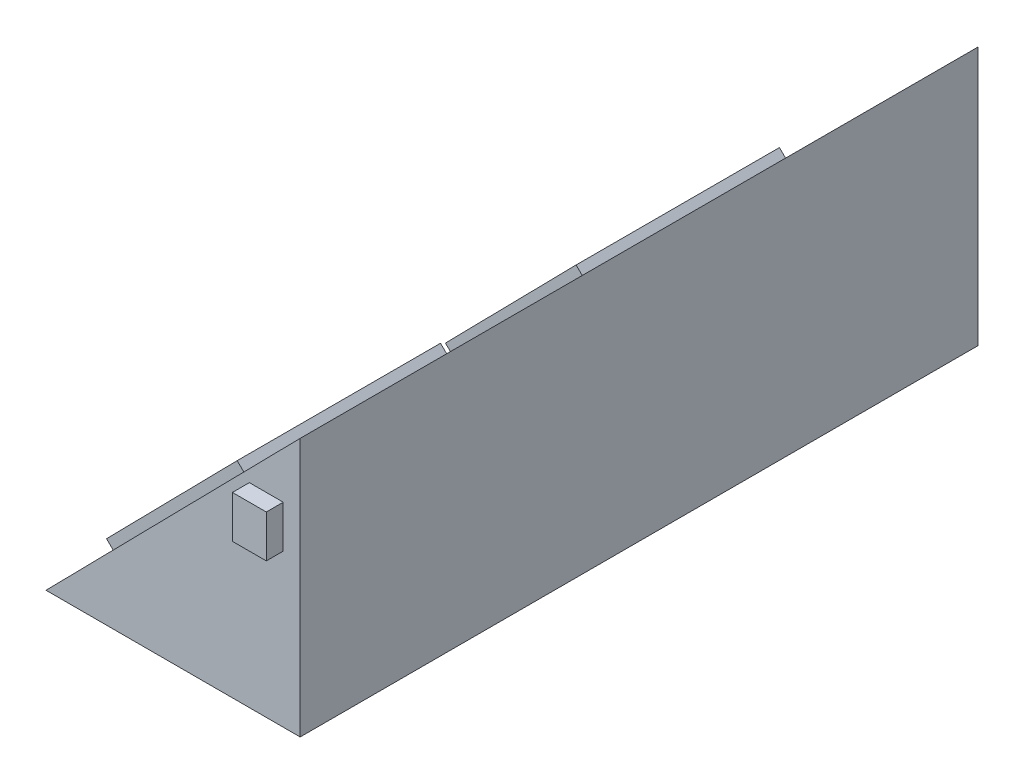
ISO-10303-21;
HEADER;
FILE_DESCRIPTION(('STEP AP214'),'2;1');
FILE_NAME('part.step','',(''),(''),'','','');
FILE_SCHEMA(('AUTOMOTIVE_DESIGN { 1 0 10303 214 1 1 1 1 }'));
ENDSEC;
DATA;
#1=APPLICATION_CONTEXT('core data for automotive mechanical design processes');
#2=APPLICATION_PROTOCOL_DEFINITION('international standard','automotive_design',2000,#1);
#3=PRODUCT_CONTEXT('',#1,'mechanical');
#4=PRODUCT('Part','Part','',(#3));
#5=PRODUCT_RELATED_PRODUCT_CATEGORY('part','',(#4));
#6=PRODUCT_DEFINITION_FORMATION('','',#4);
#7=PRODUCT_DEFINITION_CONTEXT('part definition',#1,'design');
#8=PRODUCT_DEFINITION('design','',#6,#7);
#9=PRODUCT_DEFINITION_SHAPE('','',#8);
#10=(LENGTH_UNIT() NAMED_UNIT(*) SI_UNIT(.MILLI.,.METRE.));
#11=(NAMED_UNIT(*) PLANE_ANGLE_UNIT() SI_UNIT($,.RADIAN.));
#12=(NAMED_UNIT(*) SI_UNIT($,.STERADIAN.) SOLID_ANGLE_UNIT());
#13=UNCERTAINTY_MEASURE_WITH_UNIT(LENGTH_MEASURE(1.E-05),#10,'distance_accuracy_value','');
#14=(GEOMETRIC_REPRESENTATION_CONTEXT(3) GLOBAL_UNCERTAINTY_ASSIGNED_CONTEXT((#13)) GLOBAL_UNIT_ASSIGNED_CONTEXT((#10,
#11,#12)) REPRESENTATION_CONTEXT('',''));
#15=CARTESIAN_POINT('',(0.,0.,0.));
#16=DIRECTION('',(0.,0.,1.));
#17=DIRECTION('',(1.,0.,0.));
#18=AXIS2_PLACEMENT_3D('',#15,#16,#17);
#19=CARTESIAN_POINT('',(0.,0.,101.6));
#20=DIRECTION('',(0.713250449154178,-0.700909264299855,0.));
#21=DIRECTION('',(0.700909264299855,0.713250449154178,0.));
#22=AXIS2_PLACEMENT_3D('',#19,#20,#21);
#23=PLANE('',#22);
#24=DIRECTION('',(0.700909264299855,0.713250449154178,0.));
#25=VECTOR('',#24,1.);
#26=CARTESIAN_POINT('',(0.,0.,91.44));
#27=LINE('',#26,#25);
#28=CARTESIAN_POINT('',(0.,0.,91.44));
#29=VERTEX_POINT('',#28);
#30=CARTESIAN_POINT('',(19.5834048445379,19.9282175493677,91.44));
#31=VERTEX_POINT('',#30);
#32=EDGE_CURVE('E756',#29,#31,#27,.T.);
#33=ORIENTED_EDGE('',*,*,#32,.F.);
#34=DIRECTION('',(0.,0.,-1.));
#35=VECTOR('',#34,1.);
#36=CARTESIAN_POINT('',(0.,0.,101.6));
#37=LINE('',#36,#35);
#38=CARTESIAN_POINT('',(0.,0.,101.6));
#39=VERTEX_POINT('',#38);
#40=EDGE_CURVE('E383',#39,#29,#37,.T.);
#41=ORIENTED_EDGE('',*,*,#40,.F.);
#42=DIRECTION('',(-0.700909264299855,-0.713250449154178,0.));
#43=VECTOR('',#42,1.);
#44=CARTESIAN_POINT('',(0.,0.,101.6));
#45=LINE('',#44,#43);
#46=CARTESIAN_POINT('',(38.1,38.7708416722376,101.6));
#47=VERTEX_POINT('',#46);
#48=EDGE_CURVE('E374',#47,#39,#45,.T.);
#49=ORIENTED_EDGE('',*,*,#48,.F.);
#50=DIRECTION('',(0.,0.,-1.));
#51=VECTOR('',#50,1.);
#52=CARTESIAN_POINT('',(38.1,38.7708416722376,101.6));
#53=LINE('',#52,#51);
#54=CARTESIAN_POINT('',(38.1,38.7708416722376,0.));
#55=VERTEX_POINT('',#54);
#56=EDGE_CURVE('E45',#47,#55,#53,.T.);
#57=ORIENTED_EDGE('',*,*,#56,.T.);
#58=DIRECTION('',(-0.700909264299855,-0.713250449154178,0.));
#59=VECTOR('',#58,1.);
#60=CARTESIAN_POINT('',(0.,0.,0.));
#61=LINE('',#60,#59);
#62=CARTESIAN_POINT('',(0.,0.,0.));
#63=VERTEX_POINT('',#62);
#64=EDGE_CURVE('E372',#55,#63,#61,.T.);
#65=ORIENTED_EDGE('',*,*,#64,.T.);
#66=CARTESIAN_POINT('',(0.,0.,10.16));
#67=VERTEX_POINT('',#66);
#68=EDGE_CURVE('E376',#67,#63,#37,.T.);
#69=ORIENTED_EDGE('',*,*,#68,.F.);
#70=DIRECTION('',(-0.700909264299855,-0.713250449154178,0.));
#71=VECTOR('',#70,1.);
#72=CARTESIAN_POINT('',(0.,0.,10.16));
#73=LINE('',#72,#71);
#74=CARTESIAN_POINT('',(19.5834048445379,19.9282175493677,10.16));
#75=VERTEX_POINT('',#74);
#76=EDGE_CURVE('E251',#75,#67,#73,.T.);
#77=ORIENTED_EDGE('',*,*,#76,.F.);
#78=DIRECTION('',(0.,0.,-1.));
#79=VECTOR('',#78,1.);
#80=CARTESIAN_POINT('',(19.5834048445379,19.9282175493677,10.16));
#81=LINE('',#80,#79);
#82=CARTESIAN_POINT('',(19.5834048445379,19.9282175493677,40.64));
#83=VERTEX_POINT('',#82);
#84=EDGE_CURVE('E277',#83,#75,#81,.T.);
#85=ORIENTED_EDGE('',*,*,#84,.F.);
#86=DIRECTION('',(0.700909264299855,0.713250449154178,0.));
#87=VECTOR('',#86,1.);
#88=CARTESIAN_POINT('',(0.,0.,40.64));
#89=LINE('',#88,#87);
#90=CARTESIAN_POINT('',(0.,0.,40.64));
#91=VERTEX_POINT('',#90);
#92=EDGE_CURVE('E274',#91,#83,#89,.T.);
#93=ORIENTED_EDGE('',*,*,#92,.F.);
#94=CARTESIAN_POINT('',(0.,0.,60.96));
#95=VERTEX_POINT('',#94);
#96=EDGE_CURVE('E386',#95,#91,#37,.T.);
#97=ORIENTED_EDGE('',*,*,#96,.F.);
#98=DIRECTION('',(-0.700909264299855,-0.713250449154178,0.));
#99=VECTOR('',#98,1.);
#100=CARTESIAN_POINT('',(0.,0.,60.96));
#101=LINE('',#100,#99);
#102=CARTESIAN_POINT('',(19.5834048445379,19.9282175493677,60.96));
#103=VERTEX_POINT('',#102);
#104=EDGE_CURVE('E764',#103,#95,#101,.T.);
#105=ORIENTED_EDGE('',*,*,#104,.F.);
#106=DIRECTION('',(0.,0.,-1.));
#107=VECTOR('',#106,1.);
#108=CARTESIAN_POINT('',(19.5834048445379,19.9282175493677,91.44));
#109=LINE('',#108,#107);
#110=EDGE_CURVE('E758',#31,#103,#109,.T.);
#111=ORIENTED_EDGE('',*,*,#110,.F.);
#112=EDGE_LOOP('',(#33,#41,#49,#57,#65,#69,#77,#85,#93,#97,#105,#111));
#113=FACE_BOUND('',#112,.T.);
#114=ADVANCED_FACE('F37',(#113),#23,.F.);
#115=DIRECTION('',(0.700909264299855,0.713250449154178,0.));
#116=VECTOR('',#115,1.);
#117=CARTESIAN_POINT('',(0.,0.,63.5));
#118=LINE('',#117,#116);
#119=CARTESIAN_POINT('',(0.,0.,63.5));
#120=VERTEX_POINT('',#119);
#121=CARTESIAN_POINT('',(17.8030953132163,18.1165614085161,63.5));
#122=VERTEX_POINT('',#121);
#123=EDGE_CURVE('E755',#120,#122,#118,.T.);
#124=ORIENTED_EDGE('',*,*,#123,.F.);
#125=CARTESIAN_POINT('',(0.,0.,88.9));
#126=VERTEX_POINT('',#125);
#127=EDGE_CURVE('E385',#126,#120,#37,.T.);
#128=ORIENTED_EDGE('',*,*,#127,.F.);
#129=DIRECTION('',(-0.700909264299855,-0.713250449154178,0.));
#130=VECTOR('',#129,1.);
#131=CARTESIAN_POINT('',(0.,0.,88.9));
#132=LINE('',#131,#130);
#133=CARTESIAN_POINT('',(17.8030953132163,18.1165614085161,88.9));
#134=VERTEX_POINT('',#133);
#135=EDGE_CURVE('E232',#134,#126,#132,.T.);
#136=ORIENTED_EDGE('',*,*,#135,.F.);
#137=DIRECTION('',(0.,0.,1.));
#138=VECTOR('',#137,1.);
#139=CARTESIAN_POINT('',(17.8030953132163,18.1165614085161,88.9));
#140=LINE('',#139,#138);
#141=EDGE_CURVE('E752',#122,#134,#140,.T.);
#142=ORIENTED_EDGE('',*,*,#141,.F.);
#143=EDGE_LOOP('',(#124,#128,#136,#142));
#144=FACE_BOUND('',#143,.T.);
#145=ADVANCED_FACE('F454',(#144),#23,.F.);
#146=DIRECTION('',(0.700909264299855,0.713250449154178,0.));
#147=VECTOR('',#146,1.);
#148=CARTESIAN_POINT('',(0.,0.,12.7));
#149=LINE('',#148,#147);
#150=CARTESIAN_POINT('',(0.,0.,12.7));
#151=VERTEX_POINT('',#150);
#152=CARTESIAN_POINT('',(17.8030953132163,18.1165614085161,12.7));
#153=VERTEX_POINT('',#152);
#154=EDGE_CURVE('E241',#151,#153,#149,.T.);
#155=ORIENTED_EDGE('',*,*,#154,.F.);
#156=CARTESIAN_POINT('',(0.,0.,38.1));
#157=VERTEX_POINT('',#156);
#158=EDGE_CURVE('E387',#157,#151,#37,.T.);
#159=ORIENTED_EDGE('',*,*,#158,.F.);
#160=DIRECTION('',(-0.700909264299855,-0.713250449154178,0.));
#161=VECTOR('',#160,1.);
#162=CARTESIAN_POINT('',(0.,0.,38.1));
#163=LINE('',#162,#161);
#164=CARTESIAN_POINT('',(17.8030953132163,18.1165614085161,38.1));
#165=VERTEX_POINT('',#164);
#166=EDGE_CURVE('E268',#165,#157,#163,.T.);
#167=ORIENTED_EDGE('',*,*,#166,.F.);
#168=DIRECTION('',(0.,0.,1.));
#169=VECTOR('',#168,1.);
#170=CARTESIAN_POINT('',(17.8030953132163,18.1165614085161,12.7));
#171=LINE('',#170,#169);
#172=EDGE_CURVE('E60',#153,#165,#171,.T.);
#173=ORIENTED_EDGE('',*,*,#172,.F.);
#174=EDGE_LOOP('',(#155,#159,#167,#173));
#175=FACE_BOUND('',#174,.T.);
#176=ADVANCED_FACE('F429',(#175),#23,.F.);
#177=CARTESIAN_POINT('',(0.,0.,101.6));
#178=DIRECTION('',(0.,0.,1.));
#179=DIRECTION('',(1.,0.,0.));
#180=AXIS2_PLACEMENT_3D('',#177,#178,#179);
#181=PLANE('',#180);
#182=DIRECTION('',(1.,0.,0.));
#183=VECTOR('',#182,1.);
#184=CARTESIAN_POINT('',(38.1,0.,101.6));
#185=LINE('',#184,#183);
#186=CARTESIAN_POINT('',(38.1,0.,101.6));
#187=VERTEX_POINT('',#186);
#188=EDGE_CURVE('E368',#39,#187,#185,.T.);
#189=ORIENTED_EDGE('',*,*,#188,.T.);
#190=DIRECTION('',(0.,1.,0.));
#191=VECTOR('',#190,1.);
#192=CARTESIAN_POINT('',(38.1,38.7708416722376,101.6));
#193=LINE('',#192,#191);
#194=EDGE_CURVE('E371',#187,#47,#193,.T.);
#195=ORIENTED_EDGE('',*,*,#194,.T.);
#196=ORIENTED_EDGE('',*,*,#48,.T.);
#197=EDGE_LOOP('',(#189,#195,#196));
#198=FACE_BOUND('',#197,.T.);
#199=DIRECTION('',(1.,0.,0.));
#200=VECTOR('',#199,1.);
#201=CARTESIAN_POINT('',(30.48,22.86,101.6));
#202=LINE('',#201,#200);
#203=CARTESIAN_POINT('',(30.48,22.86,101.6));
#204=VERTEX_POINT('',#203);
#205=CARTESIAN_POINT('',(35.56,22.86,101.6));
#206=VERTEX_POINT('',#205);
#207=EDGE_CURVE('E352',#204,#206,#202,.T.);
#208=ORIENTED_EDGE('',*,*,#207,.F.);
#209=DIRECTION('',(0.,-1.,0.));
#210=VECTOR('',#209,1.);
#211=CARTESIAN_POINT('',(30.48,22.86,101.6));
#212=LINE('',#211,#210);
#213=CARTESIAN_POINT('',(30.48,29.21,101.6));
#214=VERTEX_POINT('',#213);
#215=EDGE_CURVE('E332',#214,#204,#212,.T.);
#216=ORIENTED_EDGE('',*,*,#215,.F.);
#217=DIRECTION('',(-1.,0.,0.));
#218=VECTOR('',#217,1.);
#219=CARTESIAN_POINT('',(30.48,29.21,101.6));
#220=LINE('',#219,#218);
#221=CARTESIAN_POINT('',(35.56,29.21,101.6));
#222=VERTEX_POINT('',#221);
#223=EDGE_CURVE('E343',#222,#214,#220,.T.);
#224=ORIENTED_EDGE('',*,*,#223,.F.);
#225=DIRECTION('',(0.,1.,0.));
#226=VECTOR('',#225,1.);
#227=CARTESIAN_POINT('',(35.56,22.86,101.6));
#228=LINE('',#227,#226);
#229=EDGE_CURVE('E354',#206,#222,#228,.T.);
#230=ORIENTED_EDGE('',*,*,#229,.F.);
#231=EDGE_LOOP('',(#208,#216,#224,#230));
#232=FACE_BOUND('',#231,.T.);
#233=ADVANCED_FACE('F462',(#198,#232),#181,.T.);
#234=CARTESIAN_POINT('',(38.1,0.,101.6));
#235=DIRECTION('',(0.,1.,0.));
#236=DIRECTION('',(-1.,0.,0.));
#237=AXIS2_PLACEMENT_3D('',#234,#235,#236);
#238=PLANE('',#237);
#239=DIRECTION('',(1.,0.,0.));
#240=VECTOR('',#239,1.);
#241=CARTESIAN_POINT('',(38.1,0.,0.));
#242=LINE('',#241,#240);
#243=CARTESIAN_POINT('',(38.1,0.,0.));
#244=VERTEX_POINT('',#243);
#245=EDGE_CURVE('E367',#63,#244,#242,.T.);
#246=ORIENTED_EDGE('',*,*,#245,.T.);
#247=DIRECTION('',(0.,0.,-1.));
#248=VECTOR('',#247,1.);
#249=CARTESIAN_POINT('',(38.1,0.,101.6));
#250=LINE('',#249,#248);
#251=EDGE_CURVE('E11',#187,#244,#250,.T.);
#252=ORIENTED_EDGE('',*,*,#251,.F.);
#253=ORIENTED_EDGE('',*,*,#188,.F.);
#254=ORIENTED_EDGE('',*,*,#40,.T.);
#255=DIRECTION('',(0.,0.,1.));
#256=VECTOR('',#255,1.);
#257=CARTESIAN_POINT('',(0.,0.,88.9));
#258=LINE('',#257,#256);
#259=EDGE_CURVE('E236',#126,#29,#258,.T.);
#260=ORIENTED_EDGE('',*,*,#259,.F.);
#261=ORIENTED_EDGE('',*,*,#127,.T.);
#262=DIRECTION('',(0.,0.,1.));
#263=VECTOR('',#262,1.);
#264=CARTESIAN_POINT('',(0.,0.,60.96));
#265=LINE('',#264,#263);
#266=EDGE_CURVE('E409',#95,#120,#265,.T.);
#267=ORIENTED_EDGE('',*,*,#266,.F.);
#268=ORIENTED_EDGE('',*,*,#96,.T.);
#269=DIRECTION('',(0.,0.,1.));
#270=VECTOR('',#269,1.);
#271=CARTESIAN_POINT('',(0.,0.,38.1));
#272=LINE('',#271,#270);
#273=EDGE_CURVE('E271',#157,#91,#272,.T.);
#274=ORIENTED_EDGE('',*,*,#273,.F.);
#275=ORIENTED_EDGE('',*,*,#158,.T.);
#276=DIRECTION('',(0.,0.,1.));
#277=VECTOR('',#276,1.);
#278=CARTESIAN_POINT('',(0.,0.,10.16));
#279=LINE('',#278,#277);
#280=EDGE_CURVE('E238',#67,#151,#279,.T.);
#281=ORIENTED_EDGE('',*,*,#280,.F.);
#282=ORIENTED_EDGE('',*,*,#68,.T.);
#283=EDGE_LOOP('',(#246,#252,#253,#254,#260,#261,#267,#268,#274,#275,#281,#282));
#284=FACE_BOUND('',#283,.T.);
#285=ADVANCED_FACE('F39',(#284),#238,.F.);
#286=CARTESIAN_POINT('',(38.1,38.7708416722376,101.6));
#287=DIRECTION('',(-1.,0.,0.));
#288=DIRECTION('',(0.,-1.,0.));
#289=AXIS2_PLACEMENT_3D('',#286,#287,#288);
#290=PLANE('',#289);
#291=DIRECTION('',(0.,1.,0.));
#292=VECTOR('',#291,1.);
#293=CARTESIAN_POINT('',(38.1,38.7708416722376,0.));
#294=LINE('',#293,#292);
#295=EDGE_CURVE('E379',#244,#55,#294,.T.);
#296=ORIENTED_EDGE('',*,*,#295,.T.);
#297=ORIENTED_EDGE('',*,*,#56,.F.);
#298=ORIENTED_EDGE('',*,*,#194,.F.);
#299=ORIENTED_EDGE('',*,*,#251,.T.);
#300=EDGE_LOOP('',(#296,#297,#298,#299));
#301=FACE_BOUND('',#300,.T.);
#302=ADVANCED_FACE('F471',(#301),#290,.F.);
#303=CARTESIAN_POINT('',(0.,0.,0.));
#304=DIRECTION('',(0.,0.,1.));
#305=DIRECTION('',(1.,0.,0.));
#306=AXIS2_PLACEMENT_3D('',#303,#304,#305);
#307=PLANE('',#306);
#308=DIRECTION('',(-1.,0.,0.));
#309=VECTOR('',#308,1.);
#310=CARTESIAN_POINT('',(0.,29.21,0.));
#311=LINE('',#310,#309);
#312=CARTESIAN_POINT('',(35.56,29.21,0.));
#313=VERTEX_POINT('',#312);
#314=CARTESIAN_POINT('',(30.48,29.21,0.));
#315=VERTEX_POINT('',#314);
#316=EDGE_CURVE('E310',#313,#315,#311,.T.);
#317=ORIENTED_EDGE('',*,*,#316,.T.);
#318=DIRECTION('',(0.,-1.,0.));
#319=VECTOR('',#318,1.);
#320=CARTESIAN_POINT('',(30.48,0.,0.));
#321=LINE('',#320,#319);
#322=CARTESIAN_POINT('',(30.48,22.86,0.));
#323=VERTEX_POINT('',#322);
#324=EDGE_CURVE('E305',#315,#323,#321,.T.);
#325=ORIENTED_EDGE('',*,*,#324,.T.);
#326=DIRECTION('',(1.,0.,0.));
#327=VECTOR('',#326,1.);
#328=CARTESIAN_POINT('',(0.,22.86,0.));
#329=LINE('',#328,#327);
#330=CARTESIAN_POINT('',(35.56,22.86,0.));
#331=VERTEX_POINT('',#330);
#332=EDGE_CURVE('E322',#323,#331,#329,.T.);
#333=ORIENTED_EDGE('',*,*,#332,.T.);
#334=DIRECTION('',(0.,1.,0.));
#335=VECTOR('',#334,1.);
#336=CARTESIAN_POINT('',(35.56,0.,0.));
#337=LINE('',#336,#335);
#338=EDGE_CURVE('E325',#331,#313,#337,.T.);
#339=ORIENTED_EDGE('',*,*,#338,.T.);
#340=EDGE_LOOP('',(#317,#325,#333,#339));
#341=FACE_BOUND('',#340,.T.);
#342=ORIENTED_EDGE('',*,*,#245,.F.);
#343=ORIENTED_EDGE('',*,*,#64,.F.);
#344=ORIENTED_EDGE('',*,*,#295,.F.);
#345=EDGE_LOOP('',(#342,#343,#344));
#346=FACE_BOUND('',#345,.T.);
#347=ADVANCED_FACE('F398',(#341,#346),#307,.F.);
#348=CARTESIAN_POINT('',(30.48,22.86,104.14));
#349=DIRECTION('',(1.,0.,0.));
#350=DIRECTION('',(0.,0.,-1.));
#351=AXIS2_PLACEMENT_3D('',#348,#349,#350);
#352=PLANE('',#351);
#353=ORIENTED_EDGE('',*,*,#215,.T.);
#354=DIRECTION('',(0.,0.,-1.));
#355=VECTOR('',#354,1.);
#356=CARTESIAN_POINT('',(30.48,22.86,104.14));
#357=LINE('',#356,#355);
#358=CARTESIAN_POINT('',(30.48,22.86,104.14));
#359=VERTEX_POINT('',#358);
#360=EDGE_CURVE('E365',#359,#204,#357,.T.);
#361=ORIENTED_EDGE('',*,*,#360,.F.);
#362=DIRECTION('',(0.,-1.,0.));
#363=VECTOR('',#362,1.);
#364=CARTESIAN_POINT('',(30.48,22.86,104.14));
#365=LINE('',#364,#363);
#366=CARTESIAN_POINT('',(30.48,29.21,104.14));
#367=VERTEX_POINT('',#366);
#368=EDGE_CURVE('E339',#367,#359,#365,.T.);
#369=ORIENTED_EDGE('',*,*,#368,.F.);
#370=DIRECTION('',(0.,0.,-1.));
#371=VECTOR('',#370,1.);
#372=CARTESIAN_POINT('',(30.48,29.21,104.14));
#373=LINE('',#372,#371);
#374=EDGE_CURVE('E349',#367,#214,#373,.T.);
#375=ORIENTED_EDGE('',*,*,#374,.T.);
#376=EDGE_LOOP('',(#353,#361,#369,#375));
#377=FACE_BOUND('',#376,.T.);
#378=ADVANCED_FACE('F474',(#377),#352,.F.);
#379=CARTESIAN_POINT('',(30.48,22.86,104.14));
#380=DIRECTION('',(0.,1.,0.));
#381=DIRECTION('',(0.,0.,1.));
#382=AXIS2_PLACEMENT_3D('',#379,#380,#381);
#383=PLANE('',#382);
#384=ORIENTED_EDGE('',*,*,#207,.T.);
#385=DIRECTION('',(0.,0.,-1.));
#386=VECTOR('',#385,1.);
#387=CARTESIAN_POINT('',(35.56,22.86,104.14));
#388=LINE('',#387,#386);
#389=CARTESIAN_POINT('',(35.56,22.86,104.14));
#390=VERTEX_POINT('',#389);
#391=EDGE_CURVE('E362',#390,#206,#388,.T.);
#392=ORIENTED_EDGE('',*,*,#391,.F.);
#393=DIRECTION('',(1.,0.,0.));
#394=VECTOR('',#393,1.);
#395=CARTESIAN_POINT('',(30.48,22.86,104.14));
#396=LINE('',#395,#394);
#397=EDGE_CURVE('E342',#359,#390,#396,.T.);
#398=ORIENTED_EDGE('',*,*,#397,.F.);
#399=ORIENTED_EDGE('',*,*,#360,.T.);
#400=EDGE_LOOP('',(#384,#392,#398,#399));
#401=FACE_BOUND('',#400,.T.);
#402=ADVANCED_FACE('F482',(#401),#383,.F.);
#403=CARTESIAN_POINT('',(35.56,22.86,104.14));
#404=DIRECTION('',(-1.,0.,0.));
#405=DIRECTION('',(0.,0.,1.));
#406=AXIS2_PLACEMENT_3D('',#403,#404,#405);
#407=PLANE('',#406);
#408=ORIENTED_EDGE('',*,*,#229,.T.);
#409=DIRECTION('',(0.,0.,-1.));
#410=VECTOR('',#409,1.);
#411=CARTESIAN_POINT('',(35.56,29.21,104.14));
#412=LINE('',#411,#410);
#413=CARTESIAN_POINT('',(35.56,29.21,104.14));
#414=VERTEX_POINT('',#413);
#415=EDGE_CURVE('E360',#414,#222,#412,.T.);
#416=ORIENTED_EDGE('',*,*,#415,.F.);
#417=DIRECTION('',(0.,1.,0.));
#418=VECTOR('',#417,1.);
#419=CARTESIAN_POINT('',(35.56,22.86,104.14));
#420=LINE('',#419,#418);
#421=EDGE_CURVE('E345',#390,#414,#420,.T.);
#422=ORIENTED_EDGE('',*,*,#421,.F.);
#423=ORIENTED_EDGE('',*,*,#391,.T.);
#424=EDGE_LOOP('',(#408,#416,#422,#423));
#425=FACE_BOUND('',#424,.T.);
#426=ADVANCED_FACE('F524',(#425),#407,.F.);
#427=CARTESIAN_POINT('',(30.48,29.21,104.14));
#428=DIRECTION('',(0.,-1.,0.));
#429=DIRECTION('',(0.,0.,-1.));
#430=AXIS2_PLACEMENT_3D('',#427,#428,#429);
#431=PLANE('',#430);
#432=ORIENTED_EDGE('',*,*,#223,.T.);
#433=ORIENTED_EDGE('',*,*,#374,.F.);
#434=DIRECTION('',(-1.,0.,0.));
#435=VECTOR('',#434,1.);
#436=CARTESIAN_POINT('',(30.48,29.21,104.14));
#437=LINE('',#436,#435);
#438=EDGE_CURVE('E347',#414,#367,#437,.T.);
#439=ORIENTED_EDGE('',*,*,#438,.F.);
#440=ORIENTED_EDGE('',*,*,#415,.T.);
#441=EDGE_LOOP('',(#432,#433,#439,#440));
#442=FACE_BOUND('',#441,.T.);
#443=ADVANCED_FACE('F520',(#442),#431,.F.);
#444=CARTESIAN_POINT('',(0.,0.,104.14));
#445=DIRECTION('',(0.,0.,-1.));
#446=DIRECTION('',(-1.,0.,0.));
#447=AXIS2_PLACEMENT_3D('',#444,#445,#446);
#448=PLANE('',#447);
#449=ORIENTED_EDGE('',*,*,#368,.T.);
#450=ORIENTED_EDGE('',*,*,#397,.T.);
#451=ORIENTED_EDGE('',*,*,#421,.T.);
#452=ORIENTED_EDGE('',*,*,#438,.T.);
#453=EDGE_LOOP('',(#449,#450,#451,#452));
#454=FACE_BOUND('',#453,.T.);
#455=ADVANCED_FACE('F517',(#454),#448,.F.);
#456=CARTESIAN_POINT('',(30.48,0.,-2.54));
#457=DIRECTION('',(-1.,0.,0.));
#458=DIRECTION('',(0.,0.,1.));
#459=AXIS2_PLACEMENT_3D('',#456,#457,#458);
#460=PLANE('',#459);
#461=ORIENTED_EDGE('',*,*,#324,.F.);
#462=DIRECTION('',(0.,0.,1.));
#463=VECTOR('',#462,1.);
#464=CARTESIAN_POINT('',(30.48,29.21,-2.54));
#465=LINE('',#464,#463);
#466=CARTESIAN_POINT('',(30.48,29.21,-2.54));
#467=VERTEX_POINT('',#466);
#468=EDGE_CURVE('E330',#467,#315,#465,.T.);
#469=ORIENTED_EDGE('',*,*,#468,.F.);
#470=DIRECTION('',(0.,-1.,0.));
#471=VECTOR('',#470,1.);
#472=CARTESIAN_POINT('',(30.48,0.,-2.54));
#473=LINE('',#472,#471);
#474=CARTESIAN_POINT('',(30.48,22.86,-2.54));
#475=VERTEX_POINT('',#474);
#476=EDGE_CURVE('E306',#467,#475,#473,.T.);
#477=ORIENTED_EDGE('',*,*,#476,.T.);
#478=DIRECTION('',(0.,0.,1.));
#479=VECTOR('',#478,1.);
#480=CARTESIAN_POINT('',(30.48,22.86,-2.54));
#481=LINE('',#480,#479);
#482=EDGE_CURVE('E319',#475,#323,#481,.T.);
#483=ORIENTED_EDGE('',*,*,#482,.T.);
#484=EDGE_LOOP('',(#461,#469,#477,#483));
#485=FACE_BOUND('',#484,.T.);
#486=ADVANCED_FACE('F491',(#485),#460,.T.);
#487=CARTESIAN_POINT('',(0.,29.21,-2.54));
#488=DIRECTION('',(0.,1.,0.));
#489=DIRECTION('',(0.,0.,1.));
#490=AXIS2_PLACEMENT_3D('',#487,#488,#489);
#491=PLANE('',#490);
#492=ORIENTED_EDGE('',*,*,#316,.F.);
#493=DIRECTION('',(0.,0.,1.));
#494=VECTOR('',#493,1.);
#495=CARTESIAN_POINT('',(35.56,29.21,-2.54));
#496=LINE('',#495,#494);
#497=CARTESIAN_POINT('',(35.56,29.21,-2.54));
#498=VERTEX_POINT('',#497);
#499=EDGE_CURVE('E333',#498,#313,#496,.T.);
#500=ORIENTED_EDGE('',*,*,#499,.F.);
#501=DIRECTION('',(-1.,0.,0.));
#502=VECTOR('',#501,1.);
#503=CARTESIAN_POINT('',(0.,29.21,-2.54));
#504=LINE('',#503,#502);
#505=EDGE_CURVE('E316',#498,#467,#504,.T.);
#506=ORIENTED_EDGE('',*,*,#505,.T.);
#507=ORIENTED_EDGE('',*,*,#468,.T.);
#508=EDGE_LOOP('',(#492,#500,#506,#507));
#509=FACE_BOUND('',#508,.T.);
#510=ADVANCED_FACE('F487',(#509),#491,.T.);
#511=CARTESIAN_POINT('',(35.56,0.,-2.54));
#512=DIRECTION('',(1.,0.,0.));
#513=DIRECTION('',(0.,0.,-1.));
#514=AXIS2_PLACEMENT_3D('',#511,#512,#513);
#515=PLANE('',#514);
#516=ORIENTED_EDGE('',*,*,#338,.F.);
#517=DIRECTION('',(0.,0.,1.));
#518=VECTOR('',#517,1.);
#519=CARTESIAN_POINT('',(35.56,22.86,-2.54));
#520=LINE('',#519,#518);
#521=CARTESIAN_POINT('',(35.56,22.86,-2.54));
#522=VERTEX_POINT('',#521);
#523=EDGE_CURVE('E335',#522,#331,#520,.T.);
#524=ORIENTED_EDGE('',*,*,#523,.F.);
#525=DIRECTION('',(0.,1.,0.));
#526=VECTOR('',#525,1.);
#527=CARTESIAN_POINT('',(35.56,0.,-2.54));
#528=LINE('',#527,#526);
#529=EDGE_CURVE('E313',#522,#498,#528,.T.);
#530=ORIENTED_EDGE('',*,*,#529,.T.);
#531=ORIENTED_EDGE('',*,*,#499,.T.);
#532=EDGE_LOOP('',(#516,#524,#530,#531));
#533=FACE_BOUND('',#532,.T.);
#534=ADVANCED_FACE('F498',(#533),#515,.T.);
#535=CARTESIAN_POINT('',(0.,22.86,-2.54));
#536=DIRECTION('',(0.,-1.,0.));
#537=DIRECTION('',(0.,0.,-1.));
#538=AXIS2_PLACEMENT_3D('',#535,#536,#537);
#539=PLANE('',#538);
#540=ORIENTED_EDGE('',*,*,#332,.F.);
#541=ORIENTED_EDGE('',*,*,#482,.F.);
#542=DIRECTION('',(1.,0.,0.));
#543=VECTOR('',#542,1.);
#544=CARTESIAN_POINT('',(0.,22.86,-2.54));
#545=LINE('',#544,#543);
#546=EDGE_CURVE('E309',#475,#522,#545,.T.);
#547=ORIENTED_EDGE('',*,*,#546,.T.);
#548=ORIENTED_EDGE('',*,*,#523,.T.);
#549=EDGE_LOOP('',(#540,#541,#547,#548));
#550=FACE_BOUND('',#549,.T.);
#551=ADVANCED_FACE('F495',(#550),#539,.T.);
#552=CARTESIAN_POINT('',(0.,0.,-2.54));
#553=DIRECTION('',(0.,0.,1.));
#554=DIRECTION('',(1.,0.,0.));
#555=AXIS2_PLACEMENT_3D('',#552,#553,#554);
#556=PLANE('',#555);
#557=ORIENTED_EDGE('',*,*,#476,.F.);
#558=ORIENTED_EDGE('',*,*,#505,.F.);
#559=ORIENTED_EDGE('',*,*,#529,.F.);
#560=ORIENTED_EDGE('',*,*,#546,.F.);
#561=EDGE_LOOP('',(#557,#558,#559,#560));
#562=FACE_BOUND('',#561,.T.);
#563=ADVANCED_FACE('F500',(#562),#556,.F.);
#564=CARTESIAN_POINT('',(-1.08699368451097,1.06818571879297,10.16));
#565=DIRECTION('',(0.700909264299855,0.713250449154178,0.));
#566=DIRECTION('',(-0.713250449154178,0.700909264299855,0.));
#567=AXIS2_PLACEMENT_3D('',#564,#565,#566);
#568=PLANE('',#567);
#569=ORIENTED_EDGE('',*,*,#280,.T.);
#570=DIRECTION('',(0.713250449154178,-0.700909264299855,0.));
#571=VECTOR('',#570,1.);
#572=CARTESIAN_POINT('',(-1.08699368451097,1.06818571879297,12.7));
#573=LINE('',#572,#571);
#574=CARTESIAN_POINT('',(-1.08699368451097,1.06818571879297,12.7));
#575=VERTEX_POINT('',#574);
#576=EDGE_CURVE('E302',#575,#151,#573,.T.);
#577=ORIENTED_EDGE('',*,*,#576,.F.);
#578=DIRECTION('',(0.,0.,1.));
#579=VECTOR('',#578,1.);
#580=CARTESIAN_POINT('',(-1.08699368451097,1.06818571879297,10.16));
#581=LINE('',#580,#579);
#582=CARTESIAN_POINT('',(-1.08699368451097,1.06818571879297,10.16));
#583=VERTEX_POINT('',#582);
#584=EDGE_CURVE('E247',#583,#575,#581,.T.);
#585=ORIENTED_EDGE('',*,*,#584,.F.);
#586=DIRECTION('',(0.713250449154178,-0.700909264299855,0.));
#587=VECTOR('',#586,1.);
#588=CARTESIAN_POINT('',(-1.08699368451097,1.06818571879297,10.16));
#589=LINE('',#588,#587);
#590=EDGE_CURVE('E264',#583,#67,#589,.T.);
#591=ORIENTED_EDGE('',*,*,#590,.T.);
#592=EDGE_LOOP('',(#569,#577,#585,#591));
#593=FACE_BOUND('',#592,.T.);
#594=ADVANCED_FACE('F438',(#593),#568,.F.);
#595=CARTESIAN_POINT('',(-1.08699368451097,1.06818571879297,12.7));
#596=DIRECTION('',(0.,0.,-1.));
#597=DIRECTION('',(-1.,0.,0.));
#598=AXIS2_PLACEMENT_3D('',#595,#596,#597);
#599=PLANE('',#598);
#600=ORIENTED_EDGE('',*,*,#154,.T.);
#601=DIRECTION('',(0.713250449154178,-0.700909264299855,0.));
#602=VECTOR('',#601,1.);
#603=CARTESIAN_POINT('',(16.7161016287053,19.1847471273091,12.7));
#604=LINE('',#603,#602);
#605=CARTESIAN_POINT('',(16.7161016287053,19.1847471273091,12.7));
#606=VERTEX_POINT('',#605);
#607=EDGE_CURVE('E299',#606,#153,#604,.T.);
#608=ORIENTED_EDGE('',*,*,#607,.F.);
#609=DIRECTION('',(0.700909264299855,0.713250449154178,0.));
#610=VECTOR('',#609,1.);
#611=CARTESIAN_POINT('',(-1.08699368451097,1.06818571879297,12.7));
#612=LINE('',#611,#610);
#613=EDGE_CURVE('E250',#575,#606,#612,.T.);
#614=ORIENTED_EDGE('',*,*,#613,.F.);
#615=ORIENTED_EDGE('',*,*,#576,.T.);
#616=EDGE_LOOP('',(#600,#608,#614,#615));
#617=FACE_BOUND('',#616,.T.);
#618=ADVANCED_FACE('F434',(#617),#599,.F.);
#619=CARTESIAN_POINT('',(16.7161016287053,19.1847471273091,12.7));
#620=DIRECTION('',(0.700909264299855,0.713250449154178,0.));
#621=DIRECTION('',(-0.713250449154178,0.700909264299855,0.));
#622=AXIS2_PLACEMENT_3D('',#619,#620,#621);
#623=PLANE('',#622);
#624=ORIENTED_EDGE('',*,*,#172,.T.);
#625=DIRECTION('',(0.713250449154178,-0.700909264299855,0.));
#626=VECTOR('',#625,1.);
#627=CARTESIAN_POINT('',(16.7161016287053,19.1847471273091,38.1));
#628=LINE('',#627,#626);
#629=CARTESIAN_POINT('',(16.7161016287053,19.1847471273091,38.1));
#630=VERTEX_POINT('',#629);
#631=EDGE_CURVE('E296',#630,#165,#628,.T.);
#632=ORIENTED_EDGE('',*,*,#631,.F.);
#633=DIRECTION('',(0.,0.,1.));
#634=VECTOR('',#633,1.);
#635=CARTESIAN_POINT('',(16.7161016287053,19.1847471273091,12.7));
#636=LINE('',#635,#634);
#637=EDGE_CURVE('E253',#606,#630,#636,.T.);
#638=ORIENTED_EDGE('',*,*,#637,.F.);
#639=ORIENTED_EDGE('',*,*,#607,.T.);
#640=EDGE_LOOP('',(#624,#632,#638,#639));
#641=FACE_BOUND('',#640,.T.);
#642=ADVANCED_FACE('F431',(#641),#623,.F.);
#643=CARTESIAN_POINT('',(-1.08699368451097,1.06818571879298,38.1));
#644=DIRECTION('',(0.,0.,1.));
#645=DIRECTION('',(1.,0.,0.));
#646=AXIS2_PLACEMENT_3D('',#643,#644,#645);
#647=PLANE('',#646);
#648=ORIENTED_EDGE('',*,*,#166,.T.);
#649=DIRECTION('',(0.713250449154178,-0.700909264299855,0.));
#650=VECTOR('',#649,1.);
#651=CARTESIAN_POINT('',(-1.08699368451097,1.06818571879298,38.1));
#652=LINE('',#651,#650);
#653=CARTESIAN_POINT('',(-1.08699368451097,1.06818571879298,38.1));
#654=VERTEX_POINT('',#653);
#655=EDGE_CURVE('E293',#654,#157,#652,.T.);
#656=ORIENTED_EDGE('',*,*,#655,.F.);
#657=DIRECTION('',(-0.700909264299855,-0.713250449154178,0.));
#658=VECTOR('',#657,1.);
#659=CARTESIAN_POINT('',(-1.08699368451097,1.06818571879298,38.1));
#660=LINE('',#659,#658);
#661=EDGE_CURVE('E255',#630,#654,#660,.T.);
#662=ORIENTED_EDGE('',*,*,#661,.F.);
#663=ORIENTED_EDGE('',*,*,#631,.T.);
#664=EDGE_LOOP('',(#648,#656,#662,#663));
#665=FACE_BOUND('',#664,.T.);
#666=ADVANCED_FACE('F428',(#665),#647,.F.);
#667=CARTESIAN_POINT('',(-1.08699368451097,1.06818571879298,38.1));
#668=DIRECTION('',(0.700909264299855,0.713250449154178,0.));
#669=DIRECTION('',(-0.713250449154178,0.700909264299855,0.));
#670=AXIS2_PLACEMENT_3D('',#667,#668,#669);
#671=PLANE('',#670);
#672=ORIENTED_EDGE('',*,*,#273,.T.);
#673=DIRECTION('',(0.713250449154178,-0.700909264299855,0.));
#674=VECTOR('',#673,1.);
#675=CARTESIAN_POINT('',(-1.08699368451097,1.06818571879298,40.64));
#676=LINE('',#675,#674);
#677=CARTESIAN_POINT('',(-1.08699368451097,1.06818571879298,40.64));
#678=VERTEX_POINT('',#677);
#679=EDGE_CURVE('E290',#678,#91,#676,.T.);
#680=ORIENTED_EDGE('',*,*,#679,.F.);
#681=DIRECTION('',(0.,0.,1.));
#682=VECTOR('',#681,1.);
#683=CARTESIAN_POINT('',(-1.08699368451097,1.06818571879298,38.1));
#684=LINE('',#683,#682);
#685=EDGE_CURVE('E257',#654,#678,#684,.T.);
#686=ORIENTED_EDGE('',*,*,#685,.F.);
#687=ORIENTED_EDGE('',*,*,#655,.T.);
#688=EDGE_LOOP('',(#672,#680,#686,#687));
#689=FACE_BOUND('',#688,.T.);
#690=ADVANCED_FACE('F415',(#689),#671,.F.);
#691=CARTESIAN_POINT('',(-1.08699368451097,1.06818571879298,40.64));
#692=DIRECTION('',(0.,0.,-1.));
#693=DIRECTION('',(-1.,0.,0.));
#694=AXIS2_PLACEMENT_3D('',#691,#692,#693);
#695=PLANE('',#694);
#696=ORIENTED_EDGE('',*,*,#92,.T.);
#697=DIRECTION('',(0.713250449154178,-0.700909264299855,0.));
#698=VECTOR('',#697,1.);
#699=CARTESIAN_POINT('',(18.496411160027,20.9964032681607,40.64));
#700=LINE('',#699,#698);
#701=CARTESIAN_POINT('',(18.496411160027,20.9964032681607,40.64));
#702=VERTEX_POINT('',#701);
#703=EDGE_CURVE('E287',#702,#83,#700,.T.);
#704=ORIENTED_EDGE('',*,*,#703,.F.);
#705=DIRECTION('',(0.700909264299855,0.713250449154178,0.));
#706=VECTOR('',#705,1.);
#707=CARTESIAN_POINT('',(-1.08699368451097,1.06818571879298,40.64));
#708=LINE('',#707,#706);
#709=EDGE_CURVE('E259',#678,#702,#708,.T.);
#710=ORIENTED_EDGE('',*,*,#709,.F.);
#711=ORIENTED_EDGE('',*,*,#679,.T.);
#712=EDGE_LOOP('',(#696,#704,#710,#711));
#713=FACE_BOUND('',#712,.T.);
#714=ADVANCED_FACE('F419',(#713),#695,.F.);
#715=CARTESIAN_POINT('',(18.496411160027,20.9964032681607,10.16));
#716=DIRECTION('',(-0.700909264299855,-0.713250449154178,0.));
#717=DIRECTION('',(0.713250449154178,-0.700909264299855,0.));
#718=AXIS2_PLACEMENT_3D('',#715,#716,#717);
#719=PLANE('',#718);
#720=ORIENTED_EDGE('',*,*,#84,.T.);
#721=DIRECTION('',(0.713250449154178,-0.700909264299855,0.));
#722=VECTOR('',#721,1.);
#723=CARTESIAN_POINT('',(18.496411160027,20.9964032681607,10.16));
#724=LINE('',#723,#722);
#725=CARTESIAN_POINT('',(18.496411160027,20.9964032681607,10.16));
#726=VERTEX_POINT('',#725);
#727=EDGE_CURVE('E284',#726,#75,#724,.T.);
#728=ORIENTED_EDGE('',*,*,#727,.F.);
#729=DIRECTION('',(0.,0.,-1.));
#730=VECTOR('',#729,1.);
#731=CARTESIAN_POINT('',(18.496411160027,20.9964032681607,10.16));
#732=LINE('',#731,#730);
#733=EDGE_CURVE('E261',#702,#726,#732,.T.);
#734=ORIENTED_EDGE('',*,*,#733,.F.);
#735=ORIENTED_EDGE('',*,*,#703,.T.);
#736=EDGE_LOOP('',(#720,#728,#734,#735));
#737=FACE_BOUND('',#736,.T.);
#738=ADVANCED_FACE('F444',(#737),#719,.F.);
#739=CARTESIAN_POINT('',(-1.08699368451097,1.06818571879297,10.16));
#740=DIRECTION('',(0.,0.,1.));
#741=DIRECTION('',(1.,0.,0.));
#742=AXIS2_PLACEMENT_3D('',#739,#740,#741);
#743=PLANE('',#742);
#744=ORIENTED_EDGE('',*,*,#76,.T.);
#745=ORIENTED_EDGE('',*,*,#590,.F.);
#746=DIRECTION('',(-0.700909264299855,-0.713250449154178,0.));
#747=VECTOR('',#746,1.);
#748=CARTESIAN_POINT('',(-1.08699368451097,1.06818571879297,10.16));
#749=LINE('',#748,#747);
#750=EDGE_CURVE('E263',#726,#583,#749,.T.);
#751=ORIENTED_EDGE('',*,*,#750,.F.);
#752=ORIENTED_EDGE('',*,*,#727,.T.);
#753=EDGE_LOOP('',(#744,#745,#751,#752));
#754=FACE_BOUND('',#753,.T.);
#755=ADVANCED_FACE('F442',(#754),#743,.F.);
#756=CARTESIAN_POINT('',(-1.08699368451097,1.06818571879298,0.));
#757=DIRECTION('',(-0.713250449154178,0.700909264299855,0.));
#758=DIRECTION('',(-0.700909264299855,-0.713250449154178,0.));
#759=AXIS2_PLACEMENT_3D('',#756,#757,#758);
#760=PLANE('',#759);
#761=ORIENTED_EDGE('',*,*,#584,.T.);
#762=ORIENTED_EDGE('',*,*,#613,.T.);
#763=ORIENTED_EDGE('',*,*,#637,.T.);
#764=ORIENTED_EDGE('',*,*,#661,.T.);
#765=ORIENTED_EDGE('',*,*,#685,.T.);
#766=ORIENTED_EDGE('',*,*,#709,.T.);
#767=ORIENTED_EDGE('',*,*,#733,.T.);
#768=ORIENTED_EDGE('',*,*,#750,.T.);
#769=EDGE_LOOP('',(#761,#762,#763,#764,#765,#766,#767,#768));
#770=FACE_BOUND('',#769,.T.);
#771=ADVANCED_FACE('F422',(#770),#760,.T.);
#772=CARTESIAN_POINT('',(-1.08699368451097,1.06818571879298,88.9));
#773=DIRECTION('',(0.700909264299855,0.713250449154178,0.));
#774=DIRECTION('',(-0.713250449154178,0.700909264299855,0.));
#775=AXIS2_PLACEMENT_3D('',#772,#773,#774);
#776=PLANE('',#775);
#777=ORIENTED_EDGE('',*,*,#259,.T.);
#778=DIRECTION('',(0.713250449154178,-0.700909264299855,0.));
#779=VECTOR('',#778,1.);
#780=CARTESIAN_POINT('',(-1.08699368451097,1.06818571879298,91.44));
#781=LINE('',#780,#779);
#782=CARTESIAN_POINT('',(-1.08699368451097,1.06818571879298,91.44));
#783=VERTEX_POINT('',#782);
#784=EDGE_CURVE('E221',#783,#29,#781,.T.);
#785=ORIENTED_EDGE('',*,*,#784,.F.);
#786=DIRECTION('',(0.,0.,1.));
#787=VECTOR('',#786,1.);
#788=CARTESIAN_POINT('',(-1.08699368451097,1.06818571879298,88.9));
#789=LINE('',#788,#787);
#790=CARTESIAN_POINT('',(-1.08699368451097,1.06818571879298,88.9));
#791=VERTEX_POINT('',#790);
#792=EDGE_CURVE('E227',#791,#783,#789,.T.);
#793=ORIENTED_EDGE('',*,*,#792,.F.);
#794=DIRECTION('',(0.713250449154178,-0.700909264299855,0.));
#795=VECTOR('',#794,1.);
#796=CARTESIAN_POINT('',(-1.08699368451097,1.06818571879298,88.9));
#797=LINE('',#796,#795);
#798=EDGE_CURVE('E52',#791,#126,#797,.T.);
#799=ORIENTED_EDGE('',*,*,#798,.T.);
#800=EDGE_LOOP('',(#777,#785,#793,#799));
#801=FACE_BOUND('',#800,.T.);
#802=ADVANCED_FACE('F234',(#801),#776,.F.);
#803=CARTESIAN_POINT('',(-1.08699368451097,1.06818571879298,91.44));
#804=DIRECTION('',(0.,0.,-1.));
#805=DIRECTION('',(-1.,0.,0.));
#806=AXIS2_PLACEMENT_3D('',#803,#804,#805);
#807=PLANE('',#806);
#808=ORIENTED_EDGE('',*,*,#32,.T.);
#809=DIRECTION('',(0.713250449154178,-0.700909264299855,0.));
#810=VECTOR('',#809,1.);
#811=CARTESIAN_POINT('',(18.496411160027,20.9964032681607,91.44));
#812=LINE('',#811,#810);
#813=CARTESIAN_POINT('',(18.496411160027,20.9964032681607,91.44));
#814=VERTEX_POINT('',#813);
#815=EDGE_CURVE('E223',#814,#31,#812,.T.);
#816=ORIENTED_EDGE('',*,*,#815,.F.);
#817=DIRECTION('',(0.700909264299855,0.713250449154178,0.));
#818=VECTOR('',#817,1.);
#819=CARTESIAN_POINT('',(-1.08699368451097,1.06818571879298,91.44));
#820=LINE('',#819,#818);
#821=EDGE_CURVE('E217',#783,#814,#820,.T.);
#822=ORIENTED_EDGE('',*,*,#821,.F.);
#823=ORIENTED_EDGE('',*,*,#784,.T.);
#824=EDGE_LOOP('',(#808,#816,#822,#823));
#825=FACE_BOUND('',#824,.T.);
#826=ADVANCED_FACE('F219',(#825),#807,.F.);
#827=CARTESIAN_POINT('',(18.496411160027,20.9964032681607,91.44));
#828=DIRECTION('',(-0.700909264299855,-0.713250449154178,0.));
#829=DIRECTION('',(0.713250449154178,-0.700909264299855,0.));
#830=AXIS2_PLACEMENT_3D('',#827,#828,#829);
#831=PLANE('',#830);
#832=ORIENTED_EDGE('',*,*,#110,.T.);
#833=DIRECTION('',(0.713250449154178,-0.700909264299855,0.));
#834=VECTOR('',#833,1.);
#835=CARTESIAN_POINT('',(18.496411160027,20.9964032681607,60.96));
#836=LINE('',#835,#834);
#837=CARTESIAN_POINT('',(18.496411160027,20.9964032681607,60.96));
#838=VERTEX_POINT('',#837);
#839=EDGE_CURVE('E243',#838,#103,#836,.T.);
#840=ORIENTED_EDGE('',*,*,#839,.F.);
#841=DIRECTION('',(0.,0.,-1.));
#842=VECTOR('',#841,1.);
#843=CARTESIAN_POINT('',(18.496411160027,20.9964032681607,91.44));
#844=LINE('',#843,#842);
#845=EDGE_CURVE('E226',#814,#838,#844,.T.);
#846=ORIENTED_EDGE('',*,*,#845,.F.);
#847=ORIENTED_EDGE('',*,*,#815,.T.);
#848=EDGE_LOOP('',(#832,#840,#846,#847));
#849=FACE_BOUND('',#848,.T.);
#850=ADVANCED_FACE('F676',(#849),#831,.F.);
#851=CARTESIAN_POINT('',(-1.08699368451097,1.06818571879298,60.96));
#852=DIRECTION('',(0.,0.,1.));
#853=DIRECTION('',(1.,0.,0.));
#854=AXIS2_PLACEMENT_3D('',#851,#852,#853);
#855=PLANE('',#854);
#856=ORIENTED_EDGE('',*,*,#104,.T.);
#857=DIRECTION('',(0.713250449154178,-0.700909264299855,0.));
#858=VECTOR('',#857,1.);
#859=CARTESIAN_POINT('',(-1.08699368451097,1.06818571879298,60.96));
#860=LINE('',#859,#858);
#861=CARTESIAN_POINT('',(-1.08699368451097,1.06818571879298,60.96));
#862=VERTEX_POINT('',#861);
#863=EDGE_CURVE('E777',#862,#95,#860,.T.);
#864=ORIENTED_EDGE('',*,*,#863,.F.);
#865=DIRECTION('',(-0.700909264299855,-0.713250449154178,0.));
#866=VECTOR('',#865,1.);
#867=CARTESIAN_POINT('',(-1.08699368451097,1.06818571879298,60.96));
#868=LINE('',#867,#866);
#869=EDGE_CURVE('E783',#838,#862,#868,.T.);
#870=ORIENTED_EDGE('',*,*,#869,.F.);
#871=ORIENTED_EDGE('',*,*,#839,.T.);
#872=EDGE_LOOP('',(#856,#864,#870,#871));
#873=FACE_BOUND('',#872,.T.);
#874=ADVANCED_FACE('F685',(#873),#855,.F.);
#875=CARTESIAN_POINT('',(-1.08699368451097,1.06818571879298,60.96));
#876=DIRECTION('',(0.700909264299855,0.713250449154178,0.));
#877=DIRECTION('',(-0.713250449154178,0.700909264299855,0.));
#878=AXIS2_PLACEMENT_3D('',#875,#876,#877);
#879=PLANE('',#878);
#880=ORIENTED_EDGE('',*,*,#266,.T.);
#881=DIRECTION('',(0.713250449154178,-0.700909264299855,0.));
#882=VECTOR('',#881,1.);
#883=CARTESIAN_POINT('',(-1.08699368451097,1.06818571879298,63.5));
#884=LINE('',#883,#882);
#885=CARTESIAN_POINT('',(-1.08699368451097,1.06818571879298,63.5));
#886=VERTEX_POINT('',#885);
#887=EDGE_CURVE('E774',#886,#120,#884,.T.);
#888=ORIENTED_EDGE('',*,*,#887,.F.);
#889=DIRECTION('',(0.,0.,1.));
#890=VECTOR('',#889,1.);
#891=CARTESIAN_POINT('',(-1.08699368451097,1.06818571879298,60.96));
#892=LINE('',#891,#890);
#893=EDGE_CURVE('E786',#862,#886,#892,.T.);
#894=ORIENTED_EDGE('',*,*,#893,.F.);
#895=ORIENTED_EDGE('',*,*,#863,.T.);
#896=EDGE_LOOP('',(#880,#888,#894,#895));
#897=FACE_BOUND('',#896,.T.);
#898=ADVANCED_FACE('F695',(#897),#879,.F.);
#899=CARTESIAN_POINT('',(-1.08699368451097,1.06818571879298,63.5));
#900=DIRECTION('',(0.,0.,-1.));
#901=DIRECTION('',(0.,1.,0.));
#902=AXIS2_PLACEMENT_3D('',#899,#900,#901);
#903=PLANE('',#902);
#904=ORIENTED_EDGE('',*,*,#123,.T.);
#905=DIRECTION('',(0.713250449154178,-0.700909264299855,0.));
#906=VECTOR('',#905,1.);
#907=CARTESIAN_POINT('',(16.7161016287053,19.1847471273091,63.5));
#908=LINE('',#907,#906);
#909=CARTESIAN_POINT('',(16.7161016287053,19.1847471273091,63.5));
#910=VERTEX_POINT('',#909);
#911=EDGE_CURVE('E771',#910,#122,#908,.T.);
#912=ORIENTED_EDGE('',*,*,#911,.F.);
#913=DIRECTION('',(0.700909264299855,0.713250449154178,0.));
#914=VECTOR('',#913,1.);
#915=CARTESIAN_POINT('',(-1.08699368451097,1.06818571879298,63.5));
#916=LINE('',#915,#914);
#917=EDGE_CURVE('E790',#886,#910,#916,.T.);
#918=ORIENTED_EDGE('',*,*,#917,.F.);
#919=ORIENTED_EDGE('',*,*,#887,.T.);
#920=EDGE_LOOP('',(#904,#912,#918,#919));
#921=FACE_BOUND('',#920,.T.);
#922=ADVANCED_FACE('F705',(#921),#903,.F.);
#923=CARTESIAN_POINT('',(16.7161016287053,19.1847471273091,88.9));
#924=DIRECTION('',(0.700909264299855,0.713250449154178,0.));
#925=DIRECTION('',(-0.713250449154178,0.700909264299855,0.));
#926=AXIS2_PLACEMENT_3D('',#923,#924,#925);
#927=PLANE('',#926);
#928=ORIENTED_EDGE('',*,*,#141,.T.);
#929=DIRECTION('',(0.713250449154178,-0.700909264299855,0.));
#930=VECTOR('',#929,1.);
#931=CARTESIAN_POINT('',(16.7161016287053,19.1847471273091,88.9));
#932=LINE('',#931,#930);
#933=CARTESIAN_POINT('',(16.7161016287053,19.1847471273091,88.9));
#934=VERTEX_POINT('',#933);
#935=EDGE_CURVE('E750',#934,#134,#932,.T.);
#936=ORIENTED_EDGE('',*,*,#935,.F.);
#937=DIRECTION('',(0.,0.,1.));
#938=VECTOR('',#937,1.);
#939=CARTESIAN_POINT('',(16.7161016287053,19.1847471273091,88.9));
#940=LINE('',#939,#938);
#941=EDGE_CURVE('E791',#910,#934,#940,.T.);
#942=ORIENTED_EDGE('',*,*,#941,.F.);
#943=ORIENTED_EDGE('',*,*,#911,.T.);
#944=EDGE_LOOP('',(#928,#936,#942,#943));
#945=FACE_BOUND('',#944,.T.);
#946=ADVANCED_FACE('F715',(#945),#927,.F.);
#947=CARTESIAN_POINT('',(-1.08699368451097,1.06818571879298,88.9));
#948=DIRECTION('',(0.,0.,1.));
#949=DIRECTION('',(1.,0.,0.));
#950=AXIS2_PLACEMENT_3D('',#947,#948,#949);
#951=PLANE('',#950);
#952=ORIENTED_EDGE('',*,*,#135,.T.);
#953=ORIENTED_EDGE('',*,*,#798,.F.);
#954=DIRECTION('',(-0.700909264299855,-0.713250449154178,0.));
#955=VECTOR('',#954,1.);
#956=CARTESIAN_POINT('',(-1.08699368451097,1.06818571879298,88.9));
#957=LINE('',#956,#955);
#958=EDGE_CURVE('E231',#934,#791,#957,.T.);
#959=ORIENTED_EDGE('',*,*,#958,.F.);
#960=ORIENTED_EDGE('',*,*,#935,.T.);
#961=EDGE_LOOP('',(#952,#953,#959,#960));
#962=FACE_BOUND('',#961,.T.);
#963=ADVANCED_FACE('F725',(#962),#951,.F.);
#964=CARTESIAN_POINT('',(-1.08699368451097,1.06818571879298,0.));
#965=DIRECTION('',(-0.713250449154178,0.700909264299855,0.));
#966=DIRECTION('',(-0.700909264299855,-0.713250449154178,0.));
#967=AXIS2_PLACEMENT_3D('',#964,#965,#966);
#968=PLANE('',#967);
#969=ORIENTED_EDGE('',*,*,#792,.T.);
#970=ORIENTED_EDGE('',*,*,#821,.T.);
#971=ORIENTED_EDGE('',*,*,#845,.T.);
#972=ORIENTED_EDGE('',*,*,#869,.T.);
#973=ORIENTED_EDGE('',*,*,#893,.T.);
#974=ORIENTED_EDGE('',*,*,#917,.T.);
#975=ORIENTED_EDGE('',*,*,#941,.T.);
#976=ORIENTED_EDGE('',*,*,#958,.T.);
#977=EDGE_LOOP('',(#969,#970,#971,#972,#973,#974,#975,#976));
#978=FACE_BOUND('',#977,.T.);
#979=ADVANCED_FACE('F229',(#978),#968,.T.);
#980=CLOSED_SHELL('',(#114,#145,#176,#233,#285,#302,#347,#378,#402,#426,#443,#455,#486,#510,
#534,#551,#563,#594,#618,#642,#666,#690,#714,#738,#755,#771,#802,#826,#850,#874,#898,#922,#946,
#963,#979));
#981=MANIFOLD_SOLID_BREP('B2',#980);
#982=ADVANCED_BREP_SHAPE_REPRESENTATION('',(#18,#981),#14);
#983=SHAPE_DEFINITION_REPRESENTATION(#9,#982);
ENDSEC;
END-ISO-10303-21;
